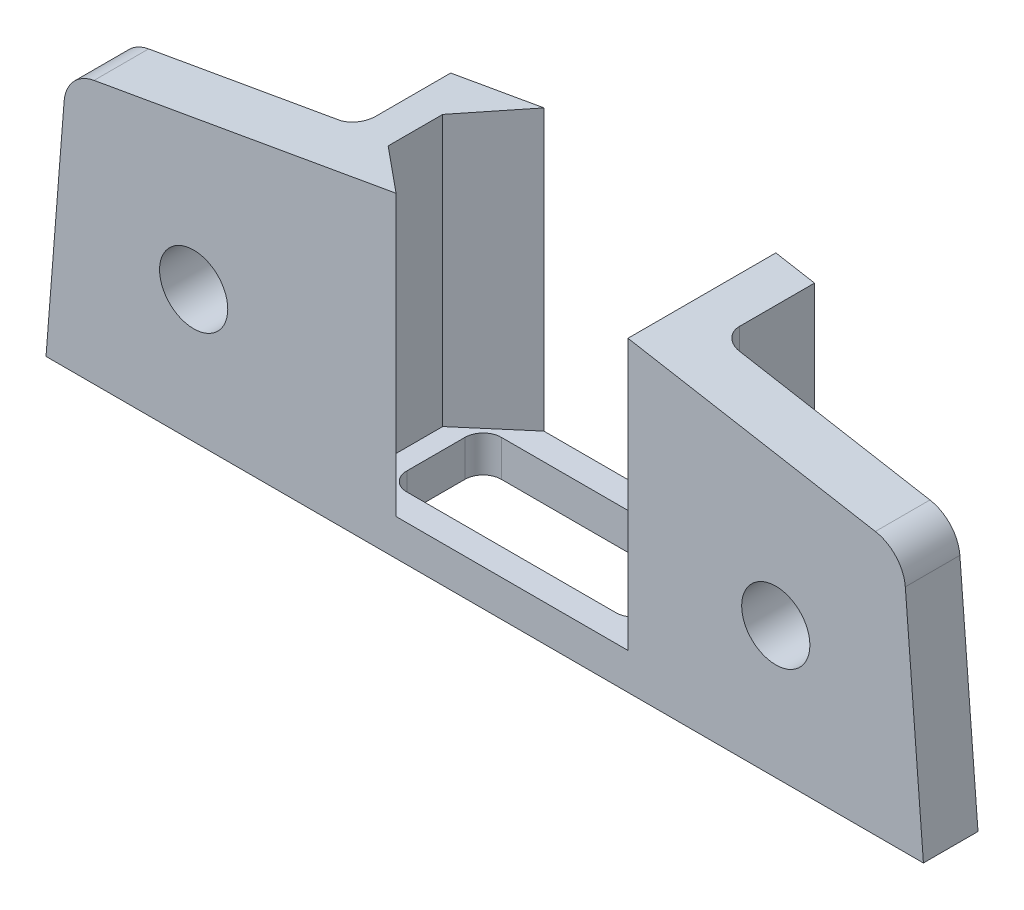
ISO-10303-21;
HEADER;
FILE_DESCRIPTION(('STEP AP214'),'2;1');
FILE_NAME('part.step','',(''),(''),'','','');
FILE_SCHEMA(('AUTOMOTIVE_DESIGN { 1 0 10303 214 1 1 1 1 }'));
ENDSEC;
DATA;
#1=APPLICATION_CONTEXT('core data for automotive mechanical design processes');
#2=APPLICATION_PROTOCOL_DEFINITION('international standard','automotive_design',2000,#1);
#3=PRODUCT_CONTEXT('',#1,'mechanical');
#4=PRODUCT('Part','Part','',(#3));
#5=PRODUCT_RELATED_PRODUCT_CATEGORY('part','',(#4));
#6=PRODUCT_DEFINITION_FORMATION('','',#4);
#7=PRODUCT_DEFINITION_CONTEXT('part definition',#1,'design');
#8=PRODUCT_DEFINITION('design','',#6,#7);
#9=PRODUCT_DEFINITION_SHAPE('','',#8);
#10=(LENGTH_UNIT() NAMED_UNIT(*) SI_UNIT(.MILLI.,.METRE.));
#11=(NAMED_UNIT(*) PLANE_ANGLE_UNIT() SI_UNIT($,.RADIAN.));
#12=(NAMED_UNIT(*) SI_UNIT($,.STERADIAN.) SOLID_ANGLE_UNIT());
#13=UNCERTAINTY_MEASURE_WITH_UNIT(LENGTH_MEASURE(1.E-05),#10,'distance_accuracy_value','');
#14=(GEOMETRIC_REPRESENTATION_CONTEXT(3) GLOBAL_UNCERTAINTY_ASSIGNED_CONTEXT((#13)) GLOBAL_UNIT_ASSIGNED_CONTEXT((#10,
#11,#12)) REPRESENTATION_CONTEXT('',''));
#15=CARTESIAN_POINT('',(0.,0.,0.));
#16=DIRECTION('',(0.,0.,1.));
#17=DIRECTION('',(1.,0.,0.));
#18=AXIS2_PLACEMENT_3D('',#15,#16,#17);
#19=CARTESIAN_POINT('',(21.127664377862,86.2437695070583,0.));
#20=DIRECTION('',(0.,0.,1.));
#21=DIRECTION('',(1.,0.,0.));
#22=AXIS2_PLACEMENT_3D('',#19,#20,#21);
#23=PLANE('',#22);
#24=DIRECTION('',(0.,-1.,0.));
#25=VECTOR('',#24,1.);
#26=CARTESIAN_POINT('',(9.99999999999999,0.,0.));
#27=LINE('',#26,#25);
#28=CARTESIAN_POINT('',(10.,90.2367301929153,0.));
#29=VERTEX_POINT('',#28);
#30=CARTESIAN_POINT('',(10.,73.75,0.));
#31=VERTEX_POINT('',#30);
#32=EDGE_CURVE('E275',#29,#31,#27,.T.);
#33=ORIENTED_EDGE('',*,*,#32,.T.);
#34=DIRECTION('',(1.,0.,0.));
#35=VECTOR('',#34,1.);
#36=CARTESIAN_POINT('',(24.4569685951198,73.75,0.));
#37=LINE('',#36,#35);
#38=CARTESIAN_POINT('',(-9.99999999999997,73.75,0.));
#39=VERTEX_POINT('',#38);
#40=EDGE_CURVE('E302',#39,#31,#37,.T.);
#41=ORIENTED_EDGE('',*,*,#40,.F.);
#42=DIRECTION('',(0.,-1.,0.));
#43=VECTOR('',#42,1.);
#44=CARTESIAN_POINT('',(-9.99999999999993,0.,0.));
#45=LINE('',#44,#43);
#46=CARTESIAN_POINT('',(-10.,90.2367301929153,0.));
#47=VERTEX_POINT('',#46);
#48=EDGE_CURVE('E290',#47,#39,#45,.T.);
#49=ORIENTED_EDGE('',*,*,#48,.F.);
#50=DIRECTION('',(-0.984807753012207,-0.173648177666933,0.));
#51=VECTOR('',#50,1.);
#52=CARTESIAN_POINT('',(0.,92.,0.));
#53=LINE('',#52,#51);
#54=CARTESIAN_POINT('',(-4.875,91.1404059690462,0.));
#55=VERTEX_POINT('',#54);
#56=EDGE_CURVE('E207',#55,#47,#53,.T.);
#57=ORIENTED_EDGE('',*,*,#56,.F.);
#58=DIRECTION('',(0.,1.,0.));
#59=VECTOR('',#58,1.);
#60=CARTESIAN_POINT('',(-4.875,75.75,0.));
#61=LINE('',#60,#59);
#62=CARTESIAN_POINT('',(-4.875,75.75,0.));
#63=VERTEX_POINT('',#62);
#64=EDGE_CURVE('E244',#63,#55,#61,.T.);
#65=ORIENTED_EDGE('',*,*,#64,.F.);
#66=DIRECTION('',(1.,0.,0.));
#67=VECTOR('',#66,1.);
#68=CARTESIAN_POINT('',(0.,75.75,0.));
#69=LINE('',#68,#67);
#70=CARTESIAN_POINT('',(7.875,75.75,0.));
#71=VERTEX_POINT('',#70);
#72=EDGE_CURVE('E251',#63,#71,#69,.T.);
#73=ORIENTED_EDGE('',*,*,#72,.T.);
#74=DIRECTION('',(0.,1.,0.));
#75=VECTOR('',#74,1.);
#76=CARTESIAN_POINT('',(7.875,75.75,0.));
#77=LINE('',#76,#75);
#78=CARTESIAN_POINT('',(7.875,90.6114250269208,0.));
#79=VERTEX_POINT('',#78);
#80=EDGE_CURVE('E241',#71,#79,#77,.T.);
#81=ORIENTED_EDGE('',*,*,#80,.T.);
#82=DIRECTION('',(-0.984807753012208,0.173648177666933,0.));
#83=VECTOR('',#82,1.);
#84=CARTESIAN_POINT('',(21.4749607331959,88.2133850130827,0.));
#85=LINE('',#84,#83);
#86=EDGE_CURVE('E211',#29,#79,#85,.T.);
#87=ORIENTED_EDGE('',*,*,#86,.F.);
#88=EDGE_LOOP('',(#33,#41,#49,#57,#65,#73,#81,#87));
#89=FACE_BOUND('',#88,.T.);
#90=ADVANCED_FACE('F35',(#89),#23,.F.);
#91=CARTESIAN_POINT('',(21.4749607331959,88.2133850130827,8.13));
#92=DIRECTION('',(-0.173648177666933,-0.984807753012208,0.));
#93=DIRECTION('',(0.984807753012208,-0.173648177666933,0.));
#94=AXIS2_PLACEMENT_3D('',#91,#92,#93);
#95=PLANE('',#94);
#96=DIRECTION('',(0.984807753012208,-0.173648177666933,0.));
#97=VECTOR('',#96,1.);
#98=CARTESIAN_POINT('',(15.732926592981,89.2258605561517,5.13));
#99=LINE('',#98,#97);
#100=CARTESIAN_POINT('',(11.,90.0604032122069,5.13));
#101=VERTEX_POINT('',#100);
#102=CARTESIAN_POINT('',(21.4749607331959,88.2133850130827,5.13));
#103=VERTEX_POINT('',#102);
#104=EDGE_CURVE('E284',#101,#103,#99,.T.);
#105=ORIENTED_EDGE('',*,*,#104,.F.);
#106=CARTESIAN_POINT('',(11.,90.0604032122069,4.13));
#107=DIRECTION('',(-0.173648177666933,-0.984807753012208,0.));
#108=DIRECTION('',(0.984807753012208,-0.173648177666933,0.));
#109=AXIS2_PLACEMENT_3D('',#106,#107,#108);
#110=ELLIPSE('',#109,1.01542661188575,1.);
#111=CARTESIAN_POINT('',(10.,90.2367301929153,4.13));
#112=VERTEX_POINT('',#111);
#113=EDGE_CURVE('E144',#101,#112,#110,.T.);
#114=ORIENTED_EDGE('',*,*,#113,.T.);
#115=DIRECTION('',(0.,0.,-1.));
#116=VECTOR('',#115,1.);
#117=CARTESIAN_POINT('',(10.,90.2367301929153,33.4646267322729));
#118=LINE('',#117,#116);
#119=EDGE_CURVE('E272',#112,#29,#118,.T.);
#120=ORIENTED_EDGE('',*,*,#119,.T.);
#121=ORIENTED_EDGE('',*,*,#86,.T.);
#122=DIRECTION('',(0.,0.,-1.));
#123=VECTOR('',#122,1.);
#124=CARTESIAN_POINT('',(7.875,90.6114250269208,8.13));
#125=LINE('',#124,#123);
#126=CARTESIAN_POINT('',(7.875,90.6114250269208,8.13));
#127=VERTEX_POINT('',#126);
#128=EDGE_CURVE('E182',#127,#79,#125,.T.);
#129=ORIENTED_EDGE('',*,*,#128,.F.);
#130=DIRECTION('',(-0.984807753012208,0.173648177666933,0.));
#131=VECTOR('',#130,1.);
#132=CARTESIAN_POINT('',(21.4749607331959,88.2133850130827,8.13));
#133=LINE('',#132,#131);
#134=CARTESIAN_POINT('',(21.4749607331959,88.2133850130827,8.13));
#135=VERTEX_POINT('',#134);
#136=EDGE_CURVE('E223',#135,#127,#133,.T.);
#137=ORIENTED_EDGE('',*,*,#136,.F.);
#138=DIRECTION('',(0.,0.,-1.));
#139=VECTOR('',#138,1.);
#140=CARTESIAN_POINT('',(21.4749607331959,88.2133850130827,8.13));
#141=LINE('',#140,#139);
#142=EDGE_CURVE('E197',#135,#103,#141,.T.);
#143=ORIENTED_EDGE('',*,*,#142,.T.);
#144=EDGE_LOOP('',(#105,#114,#120,#121,#129,#137,#143));
#145=FACE_BOUND('',#144,.T.);
#146=ADVANCED_FACE('F370',(#145),#95,.F.);
#147=CARTESIAN_POINT('',(0.,75.75,0.));
#148=DIRECTION('',(0.,1.,0.));
#149=DIRECTION('',(0.,0.,1.));
#150=AXIS2_PLACEMENT_3D('',#147,#148,#149);
#151=PLANE('',#150);
#152=DIRECTION('',(0.760060792093325,0.,0.649851977239792));
#153=VECTOR('',#152,1.);
#154=CARTESIAN_POINT('',(-6.0743760921997,75.75,7.10453344116925));
#155=LINE('',#154,#153);
#156=CARTESIAN_POINT('',(-7.875,75.75,5.565));
#157=VERTEX_POINT('',#156);
#158=CARTESIAN_POINT('',(-4.875,75.75,8.13));
#159=VERTEX_POINT('',#158);
#160=EDGE_CURVE('E260',#157,#159,#155,.T.);
#161=ORIENTED_EDGE('',*,*,#160,.T.);
#162=DIRECTION('',(1.,0.,0.));
#163=VECTOR('',#162,1.);
#164=CARTESIAN_POINT('',(0.,75.75,8.13));
#165=LINE('',#164,#163);
#166=CARTESIAN_POINT('',(7.875,75.75,8.13));
#167=VERTEX_POINT('',#166);
#168=EDGE_CURVE('E257',#159,#167,#165,.T.);
#169=ORIENTED_EDGE('',*,*,#168,.T.);
#170=DIRECTION('',(0.,0.,1.));
#171=VECTOR('',#170,1.);
#172=CARTESIAN_POINT('',(7.875,75.75,0.));
#173=LINE('',#172,#171);
#174=EDGE_CURVE('E254',#71,#167,#173,.T.);
#175=ORIENTED_EDGE('',*,*,#174,.F.);
#176=ORIENTED_EDGE('',*,*,#72,.F.);
#177=DIRECTION('',(0.760060792093325,0.,-0.649851977239792));
#178=VECTOR('',#177,1.);
#179=CARTESIAN_POINT('',(-2.05874951257203,75.75,-2.40789416675091));
#180=LINE('',#179,#178);
#181=CARTESIAN_POINT('',(-7.875,75.75,2.565));
#182=VERTEX_POINT('',#181);
#183=EDGE_CURVE('E235',#182,#63,#180,.T.);
#184=ORIENTED_EDGE('',*,*,#183,.F.);
#185=DIRECTION('',(0.,0.,1.));
#186=VECTOR('',#185,1.);
#187=CARTESIAN_POINT('',(-7.875,75.75,0.));
#188=LINE('',#187,#186);
#189=EDGE_CURVE('E263',#182,#157,#188,.T.);
#190=ORIENTED_EDGE('',*,*,#189,.T.);
#191=EDGE_LOOP('',(#161,#169,#175,#176,#184,#190));
#192=FACE_BOUND('',#191,.T.);
#193=DIRECTION('',(0.,0.,1.));
#194=VECTOR('',#193,1.);
#195=CARTESIAN_POINT('',(-6.75,75.75,0.));
#196=LINE('',#195,#194);
#197=CARTESIAN_POINT('',(-6.75,75.75,2.465));
#198=VERTEX_POINT('',#197);
#199=CARTESIAN_POINT('',(-6.75,75.75,5.665));
#200=VERTEX_POINT('',#199);
#201=EDGE_CURVE('E179',#198,#200,#196,.T.);
#202=ORIENTED_EDGE('',*,*,#201,.F.);
#203=CARTESIAN_POINT('',(-5.75,75.75,2.465));
#204=DIRECTION('',(0.,1.,0.));
#205=DIRECTION('',(0.,0.,1.));
#206=AXIS2_PLACEMENT_3D('',#203,#204,#205);
#207=CIRCLE('',#206,1.);
#208=CARTESIAN_POINT('',(-5.75,75.75,1.465));
#209=VERTEX_POINT('',#208);
#210=EDGE_CURVE('E65',#198,#209,#207,.F.);
#211=ORIENTED_EDGE('',*,*,#210,.T.);
#212=DIRECTION('',(-1.,0.,0.));
#213=VECTOR('',#212,1.);
#214=CARTESIAN_POINT('',(-6.75,75.75,1.465));
#215=LINE('',#214,#213);
#216=CARTESIAN_POINT('',(5.75,75.75,1.465));
#217=VERTEX_POINT('',#216);
#218=EDGE_CURVE('E266',#217,#209,#215,.T.);
#219=ORIENTED_EDGE('',*,*,#218,.F.);
#220=CARTESIAN_POINT('',(5.75,75.75,2.465));
#221=DIRECTION('',(0.,1.,0.));
#222=DIRECTION('',(0.,0.,1.));
#223=AXIS2_PLACEMENT_3D('',#220,#221,#222);
#224=CIRCLE('',#223,1.);
#225=CARTESIAN_POINT('',(6.75,75.75,2.465));
#226=VERTEX_POINT('',#225);
#227=EDGE_CURVE('E139',#217,#226,#224,.F.);
#228=ORIENTED_EDGE('',*,*,#227,.T.);
#229=DIRECTION('',(0.,0.,-1.));
#230=VECTOR('',#229,1.);
#231=CARTESIAN_POINT('',(6.75,75.75,1.465));
#232=LINE('',#231,#230);
#233=CARTESIAN_POINT('',(6.75,75.75,5.665));
#234=VERTEX_POINT('',#233);
#235=EDGE_CURVE('E269',#234,#226,#232,.T.);
#236=ORIENTED_EDGE('',*,*,#235,.F.);
#237=CARTESIAN_POINT('',(5.75,75.75,5.665));
#238=DIRECTION('',(0.,1.,0.));
#239=DIRECTION('',(0.,0.,1.));
#240=AXIS2_PLACEMENT_3D('',#237,#238,#239);
#241=CIRCLE('',#240,1.);
#242=CARTESIAN_POINT('',(5.75,75.75,6.665));
#243=VERTEX_POINT('',#242);
#244=EDGE_CURVE('E51',#234,#243,#241,.F.);
#245=ORIENTED_EDGE('',*,*,#244,.T.);
#246=DIRECTION('',(1.,0.,0.));
#247=VECTOR('',#246,1.);
#248=CARTESIAN_POINT('',(0.,75.75,6.665));
#249=LINE('',#248,#247);
#250=CARTESIAN_POINT('',(-5.75,75.75,6.665));
#251=VERTEX_POINT('',#250);
#252=EDGE_CURVE('E117',#251,#243,#249,.T.);
#253=ORIENTED_EDGE('',*,*,#252,.F.);
#254=CARTESIAN_POINT('',(-5.75,75.75,5.665));
#255=DIRECTION('',(0.,1.,0.));
#256=DIRECTION('',(0.,0.,1.));
#257=AXIS2_PLACEMENT_3D('',#254,#255,#256);
#258=CIRCLE('',#257,1.);
#259=EDGE_CURVE('E44',#251,#200,#258,.F.);
#260=ORIENTED_EDGE('',*,*,#259,.T.);
#261=EDGE_LOOP('',(#202,#211,#219,#228,#236,#245,#253,#260));
#262=FACE_BOUND('',#261,.T.);
#263=ADVANCED_FACE('F495',(#192,#262),#151,.T.);
#264=CARTESIAN_POINT('',(21.127664377862,86.2437695070583,8.13));
#265=DIRECTION('',(0.,0.,1.));
#266=DIRECTION('',(1.,0.,0.));
#267=AXIS2_PLACEMENT_3D('',#264,#265,#266);
#268=PLANE('',#267);
#269=CARTESIAN_POINT('',(16.,81.,8.13));
#270=DIRECTION('',(0.,0.,1.));
#271=DIRECTION('',(1.,0.,0.));
#272=AXIS2_PLACEMENT_3D('',#269,#270,#271);
#273=CIRCLE('',#272,1.875);
#274=CARTESIAN_POINT('',(17.875,81.,8.13));
#275=VERTEX_POINT('',#274);
#276=EDGE_CURVE('E338',#275,#275,#273,.F.);
#277=ORIENTED_EDGE('',*,*,#276,.T.);
#278=EDGE_LOOP('',(#277));
#279=FACE_BOUND('',#278,.T.);
#280=CARTESIAN_POINT('',(-16.,81.,8.13));
#281=DIRECTION('',(0.,0.,1.));
#282=DIRECTION('',(1.,0.,0.));
#283=AXIS2_PLACEMENT_3D('',#280,#281,#282);
#284=CIRCLE('',#283,1.875);
#285=CARTESIAN_POINT('',(-14.125,81.,8.13));
#286=VERTEX_POINT('',#285);
#287=EDGE_CURVE('E332',#286,#286,#284,.F.);
#288=ORIENTED_EDGE('',*,*,#287,.T.);
#289=EDGE_LOOP('',(#288));
#290=FACE_BOUND('',#289,.T.);
#291=DIRECTION('',(1.,0.,0.));
#292=VECTOR('',#291,1.);
#293=CARTESIAN_POINT('',(24.4569685951198,73.75,8.13));
#294=LINE('',#293,#292);
#295=CARTESIAN_POINT('',(-24.1171297597066,73.75,8.13));
#296=VERTEX_POINT('',#295);
#297=CARTESIAN_POINT('',(24.1171297597066,73.75,8.13));
#298=VERTEX_POINT('',#297);
#299=EDGE_CURVE('E305',#296,#298,#294,.T.);
#300=ORIENTED_EDGE('',*,*,#299,.T.);
#301=DIRECTION('',(-0.0784590957278463,0.996917333733128,0.));
#302=VECTOR('',#301,1.);
#303=CARTESIAN_POINT('',(24.4569685951198,69.4319381799363,8.13));
#304=LINE('',#303,#302);
#305=CARTESIAN_POINT('',(23.1214990453283,86.4006876985139,8.13));
#306=VERTEX_POINT('',#305);
#307=EDGE_CURVE('E210',#298,#306,#304,.T.);
#308=ORIENTED_EDGE('',*,*,#307,.T.);
#309=CARTESIAN_POINT('',(21.127664377862,86.2437695070583,8.13));
#310=DIRECTION('',(0.,0.,1.));
#311=DIRECTION('',(1.,0.,0.));
#312=AXIS2_PLACEMENT_3D('',#309,#310,#311);
#313=CIRCLE('',#312,1.99999999999999);
#314=EDGE_CURVE('E226',#306,#135,#313,.T.);
#315=ORIENTED_EDGE('',*,*,#314,.T.);
#316=ORIENTED_EDGE('',*,*,#136,.T.);
#317=DIRECTION('',(0.,1.,0.));
#318=VECTOR('',#317,1.);
#319=CARTESIAN_POINT('',(7.875,75.75,8.13));
#320=LINE('',#319,#318);
#321=EDGE_CURVE('E238',#167,#127,#320,.T.);
#322=ORIENTED_EDGE('',*,*,#321,.F.);
#323=ORIENTED_EDGE('',*,*,#168,.F.);
#324=DIRECTION('',(0.,1.,0.));
#325=VECTOR('',#324,1.);
#326=CARTESIAN_POINT('',(-4.875,75.75,8.13));
#327=LINE('',#326,#325);
#328=CARTESIAN_POINT('',(-4.875,91.1404059690462,8.13));
#329=VERTEX_POINT('',#328);
#330=EDGE_CURVE('E234',#159,#329,#327,.T.);
#331=ORIENTED_EDGE('',*,*,#330,.T.);
#332=DIRECTION('',(-0.984807753012207,-0.173648177666933,0.));
#333=VECTOR('',#332,1.);
#334=CARTESIAN_POINT('',(0.,92.,8.13));
#335=LINE('',#334,#333);
#336=CARTESIAN_POINT('',(-21.4749607331959,88.2133850130827,8.13));
#337=VERTEX_POINT('',#336);
#338=EDGE_CURVE('E220',#329,#337,#335,.T.);
#339=ORIENTED_EDGE('',*,*,#338,.T.);
#340=CARTESIAN_POINT('',(-21.127664377862,86.2437695070583,8.13));
#341=DIRECTION('',(0.,0.,1.));
#342=DIRECTION('',(1.,0.,0.));
#343=AXIS2_PLACEMENT_3D('',#340,#341,#342);
#344=CIRCLE('',#343,1.99999999999997);
#345=CARTESIAN_POINT('',(-23.1214990453283,86.4006876985139,8.13));
#346=VERTEX_POINT('',#345);
#347=EDGE_CURVE('E217',#337,#346,#344,.T.);
#348=ORIENTED_EDGE('',*,*,#347,.T.);
#349=DIRECTION('',(-0.0784590957278469,-0.996917333733128,0.));
#350=VECTOR('',#349,1.);
#351=CARTESIAN_POINT('',(-23.1214990453283,86.4006876985139,8.13));
#352=LINE('',#351,#350);
#353=EDGE_CURVE('E206',#346,#296,#352,.T.);
#354=ORIENTED_EDGE('',*,*,#353,.T.);
#355=EDGE_LOOP('',(#300,#308,#315,#316,#322,#323,#331,#339,#348,#354));
#356=FACE_BOUND('',#355,.T.);
#357=ADVANCED_FACE('F400',(#279,#290,#356),#268,.T.);
#358=CARTESIAN_POINT('',(0.,92.,8.13));
#359=DIRECTION('',(0.173648177666934,-0.984807753012208,0.));
#360=DIRECTION('',(0.984807753012207,0.173648177666933,0.));
#361=AXIS2_PLACEMENT_3D('',#358,#359,#360);
#362=PLANE('',#361);
#363=ORIENTED_EDGE('',*,*,#56,.T.);
#364=DIRECTION('',(0.,0.,-1.));
#365=VECTOR('',#364,1.);
#366=CARTESIAN_POINT('',(-10.,90.2367301929153,33.4646267322729));
#367=LINE('',#366,#365);
#368=CARTESIAN_POINT('',(-10.,90.2367301929153,4.13));
#369=VERTEX_POINT('',#368);
#370=EDGE_CURVE('E287',#369,#47,#367,.T.);
#371=ORIENTED_EDGE('',*,*,#370,.F.);
#372=CARTESIAN_POINT('',(-11.,90.0604032122069,4.13));
#373=DIRECTION('',(0.173648177666934,-0.984807753012208,0.));
#374=DIRECTION('',(0.984807753012207,0.173648177666933,0.));
#375=AXIS2_PLACEMENT_3D('',#372,#373,#374);
#376=ELLIPSE('',#375,1.01542661188575,1.);
#377=CARTESIAN_POINT('',(-11.,90.0604032122069,5.13));
#378=VERTEX_POINT('',#377);
#379=EDGE_CURVE('E150',#369,#378,#376,.T.);
#380=ORIENTED_EDGE('',*,*,#379,.T.);
#381=DIRECTION('',(0.984807753012208,0.173648177666933,0.));
#382=VECTOR('',#381,1.);
#383=CARTESIAN_POINT('',(-15.732926592981,89.2258605561517,5.13));
#384=LINE('',#383,#382);
#385=CARTESIAN_POINT('',(-21.4749607331959,88.2133850130827,5.13));
#386=VERTEX_POINT('',#385);
#387=EDGE_CURVE('E293',#386,#378,#384,.T.);
#388=ORIENTED_EDGE('',*,*,#387,.F.);
#389=DIRECTION('',(0.,0.,-1.));
#390=VECTOR('',#389,1.);
#391=CARTESIAN_POINT('',(-21.4749607331959,88.2133850130827,8.13));
#392=LINE('',#391,#390);
#393=EDGE_CURVE('E200',#337,#386,#392,.T.);
#394=ORIENTED_EDGE('',*,*,#393,.F.);
#395=ORIENTED_EDGE('',*,*,#338,.F.);
#396=DIRECTION('',(-0.753325602402793,-0.132831628962072,-0.644093390054387));
#397=VECTOR('',#396,1.);
#398=CARTESIAN_POINT('',(-2.02242443866979,91.6433920050183,10.5689521049373));
#399=LINE('',#398,#397);
#400=CARTESIAN_POINT('',(-7.875,90.6114250269208,5.565));
#401=VERTEX_POINT('',#400);
#402=EDGE_CURVE('E191',#329,#401,#399,.T.);
#403=ORIENTED_EDGE('',*,*,#402,.T.);
#404=DIRECTION('',(0.,0.,-1.));
#405=VECTOR('',#404,1.);
#406=CARTESIAN_POINT('',(-7.875,90.6114250269208,8.13));
#407=LINE('',#406,#405);
#408=CARTESIAN_POINT('',(-7.875,90.6114250269208,2.565));
#409=VERTEX_POINT('',#408);
#410=EDGE_CURVE('E188',#401,#409,#407,.T.);
#411=ORIENTED_EDGE('',*,*,#410,.T.);
#412=DIRECTION('',(-0.753325602402792,-0.132831628962072,0.644093390054387));
#413=VECTOR('',#412,1.);
#414=CARTESIAN_POINT('',(-5.96719833253944,90.9478219347347,0.933829574321227));
#415=LINE('',#414,#413);
#416=EDGE_CURVE('E185',#55,#409,#415,.T.);
#417=ORIENTED_EDGE('',*,*,#416,.F.);
#418=EDGE_LOOP('',(#363,#371,#380,#388,#394,#395,#403,#411,#417));
#419=FACE_BOUND('',#418,.T.);
#420=ADVANCED_FACE('F448',(#419),#362,.F.);
#421=CARTESIAN_POINT('',(24.4569685951198,69.4319381799363,8.13));
#422=DIRECTION('',(-0.996917333733128,-0.0784590957278463,0.));
#423=DIRECTION('',(0.0784590957278463,-0.996917333733128,0.));
#424=AXIS2_PLACEMENT_3D('',#421,#422,#423);
#425=PLANE('',#424);
#426=ORIENTED_EDGE('',*,*,#307,.F.);
#427=DIRECTION('',(0.,0.,1.));
#428=VECTOR('',#427,1.);
#429=CARTESIAN_POINT('',(24.1171297597066,73.75,8.131));
#430=LINE('',#429,#428);
#431=CARTESIAN_POINT('',(24.1171297597066,73.75,5.13));
#432=VERTEX_POINT('',#431);
#433=EDGE_CURVE('E308',#432,#298,#430,.T.);
#434=ORIENTED_EDGE('',*,*,#433,.F.);
#435=DIRECTION('',(0.0784590957278463,-0.996917333733128,0.));
#436=VECTOR('',#435,1.);
#437=CARTESIAN_POINT('',(29.737189714353,2.34036758668711,5.13));
#438=LINE('',#437,#436);
#439=CARTESIAN_POINT('',(23.1214990453283,86.4006876985139,5.13));
#440=VERTEX_POINT('',#439);
#441=EDGE_CURVE('E278',#440,#432,#438,.T.);
#442=ORIENTED_EDGE('',*,*,#441,.F.);
#443=DIRECTION('',(0.,0.,-1.));
#444=VECTOR('',#443,1.);
#445=CARTESIAN_POINT('',(23.1214990453283,86.4006876985139,8.13));
#446=LINE('',#445,#444);
#447=EDGE_CURVE('E194',#306,#440,#446,.T.);
#448=ORIENTED_EDGE('',*,*,#447,.F.);
#449=EDGE_LOOP('',(#426,#434,#442,#448));
#450=FACE_BOUND('',#449,.T.);
#451=ADVANCED_FACE('F503',(#450),#425,.F.);
#452=CARTESIAN_POINT('',(21.127664377862,86.2437695070583,8.13));
#453=DIRECTION('',(0.,0.,-1.));
#454=DIRECTION('',(-1.,0.,0.));
#455=AXIS2_PLACEMENT_3D('',#452,#453,#454);
#456=CYLINDRICAL_SURFACE('',#455,1.99999999999999);
#457=ORIENTED_EDGE('',*,*,#447,.T.);
#458=CARTESIAN_POINT('',(21.127664377862,86.2437695070583,5.13));
#459=DIRECTION('',(0.,0.,1.));
#460=DIRECTION('',(1.,0.,0.));
#461=AXIS2_PLACEMENT_3D('',#458,#459,#460);
#462=CIRCLE('',#461,1.99999999999999);
#463=EDGE_CURVE('E281',#103,#440,#462,.F.);
#464=ORIENTED_EDGE('',*,*,#463,.F.);
#465=ORIENTED_EDGE('',*,*,#142,.F.);
#466=ORIENTED_EDGE('',*,*,#314,.F.);
#467=EDGE_LOOP('',(#457,#464,#465,#466));
#468=FACE_BOUND('',#467,.T.);
#469=ADVANCED_FACE('F508',(#468),#456,.T.);
#470=CARTESIAN_POINT('',(-21.127664377862,86.2437695070583,8.13));
#471=DIRECTION('',(0.,0.,-1.));
#472=DIRECTION('',(-1.,0.,0.));
#473=AXIS2_PLACEMENT_3D('',#470,#471,#472);
#474=CYLINDRICAL_SURFACE('',#473,1.99999999999997);
#475=ORIENTED_EDGE('',*,*,#393,.T.);
#476=CARTESIAN_POINT('',(-21.127664377862,86.2437695070583,5.13));
#477=DIRECTION('',(0.,0.,1.));
#478=DIRECTION('',(1.,0.,0.));
#479=AXIS2_PLACEMENT_3D('',#476,#477,#478);
#480=CIRCLE('',#479,1.99999999999997);
#481=CARTESIAN_POINT('',(-23.1214990453283,86.4006876985139,5.13));
#482=VERTEX_POINT('',#481);
#483=EDGE_CURVE('E296',#482,#386,#480,.F.);
#484=ORIENTED_EDGE('',*,*,#483,.F.);
#485=DIRECTION('',(0.,0.,-1.));
#486=VECTOR('',#485,1.);
#487=CARTESIAN_POINT('',(-23.1214990453283,86.4006876985139,8.13));
#488=LINE('',#487,#486);
#489=EDGE_CURVE('E203',#346,#482,#488,.T.);
#490=ORIENTED_EDGE('',*,*,#489,.F.);
#491=ORIENTED_EDGE('',*,*,#347,.F.);
#492=EDGE_LOOP('',(#475,#484,#490,#491));
#493=FACE_BOUND('',#492,.T.);
#494=ADVANCED_FACE('F473',(#493),#474,.T.);
#495=CARTESIAN_POINT('',(-23.1214990453283,86.4006876985139,8.13));
#496=DIRECTION('',(0.996917333733128,-0.0784590957278469,0.));
#497=DIRECTION('',(0.0784590957278469,0.996917333733128,0.));
#498=AXIS2_PLACEMENT_3D('',#495,#496,#497);
#499=PLANE('',#498);
#500=DIRECTION('',(0.0784590957278469,0.996917333733128,0.));
#501=VECTOR('',#500,1.);
#502=CARTESIAN_POINT('',(-29.737189714353,2.34036758668713,5.13));
#503=LINE('',#502,#501);
#504=CARTESIAN_POINT('',(-24.1171297597066,73.75,5.13));
#505=VERTEX_POINT('',#504);
#506=EDGE_CURVE('E299',#505,#482,#503,.T.);
#507=ORIENTED_EDGE('',*,*,#506,.F.);
#508=DIRECTION('',(0.,0.,-1.));
#509=VECTOR('',#508,1.);
#510=CARTESIAN_POINT('',(-24.1171297597066,73.75,8.131));
#511=LINE('',#510,#509);
#512=EDGE_CURVE('E311',#296,#505,#511,.T.);
#513=ORIENTED_EDGE('',*,*,#512,.F.);
#514=ORIENTED_EDGE('',*,*,#353,.F.);
#515=ORIENTED_EDGE('',*,*,#489,.T.);
#516=EDGE_LOOP('',(#507,#513,#514,#515));
#517=FACE_BOUND('',#516,.T.);
#518=ADVANCED_FACE('F463',(#517),#499,.F.);
#519=CARTESIAN_POINT('',(7.875,75.75,0.));
#520=DIRECTION('',(-1.,0.,0.));
#521=DIRECTION('',(0.,0.,1.));
#522=AXIS2_PLACEMENT_3D('',#519,#520,#521);
#523=PLANE('',#522);
#524=ORIENTED_EDGE('',*,*,#128,.T.);
#525=ORIENTED_EDGE('',*,*,#80,.F.);
#526=ORIENTED_EDGE('',*,*,#174,.T.);
#527=ORIENTED_EDGE('',*,*,#321,.T.);
#528=EDGE_LOOP('',(#524,#525,#526,#527));
#529=FACE_BOUND('',#528,.T.);
#530=ADVANCED_FACE('F391',(#529),#523,.T.);
#531=CARTESIAN_POINT('',(-7.875,75.75,0.));
#532=DIRECTION('',(-1.,0.,0.));
#533=DIRECTION('',(0.,0.,1.));
#534=AXIS2_PLACEMENT_3D('',#531,#532,#533);
#535=PLANE('',#534);
#536=DIRECTION('',(0.,1.,0.));
#537=VECTOR('',#536,1.);
#538=CARTESIAN_POINT('',(-7.875,75.75,5.565));
#539=LINE('',#538,#537);
#540=EDGE_CURVE('E231',#157,#401,#539,.T.);
#541=ORIENTED_EDGE('',*,*,#540,.F.);
#542=ORIENTED_EDGE('',*,*,#189,.F.);
#543=DIRECTION('',(0.,1.,0.));
#544=VECTOR('',#543,1.);
#545=CARTESIAN_POINT('',(-7.875,75.75,2.565));
#546=LINE('',#545,#544);
#547=EDGE_CURVE('E214',#182,#409,#546,.T.);
#548=ORIENTED_EDGE('',*,*,#547,.T.);
#549=ORIENTED_EDGE('',*,*,#410,.F.);
#550=EDGE_LOOP('',(#541,#542,#548,#549));
#551=FACE_BOUND('',#550,.T.);
#552=ADVANCED_FACE('F489',(#551),#535,.F.);
#553=CARTESIAN_POINT('',(-2.05874951257203,75.75,-2.40789416675091));
#554=DIRECTION('',(0.649851977239792,0.,0.760060792093325));
#555=DIRECTION('',(0.760060792093325,0.,-0.649851977239792));
#556=AXIS2_PLACEMENT_3D('',#553,#554,#555);
#557=PLANE('',#556);
#558=ORIENTED_EDGE('',*,*,#416,.T.);
#559=ORIENTED_EDGE('',*,*,#547,.F.);
#560=ORIENTED_EDGE('',*,*,#183,.T.);
#561=ORIENTED_EDGE('',*,*,#64,.T.);
#562=EDGE_LOOP('',(#558,#559,#560,#561));
#563=FACE_BOUND('',#562,.T.);
#564=ADVANCED_FACE('F499',(#563),#557,.T.);
#565=CARTESIAN_POINT('',(-6.0743760921997,75.75,7.10453344116925));
#566=DIRECTION('',(-0.649851977239792,0.,0.760060792093325));
#567=DIRECTION('',(0.760060792093325,0.,0.649851977239792));
#568=AXIS2_PLACEMENT_3D('',#565,#566,#567);
#569=PLANE('',#568);
#570=ORIENTED_EDGE('',*,*,#330,.F.);
#571=ORIENTED_EDGE('',*,*,#160,.F.);
#572=ORIENTED_EDGE('',*,*,#540,.T.);
#573=ORIENTED_EDGE('',*,*,#402,.F.);
#574=EDGE_LOOP('',(#570,#571,#572,#573));
#575=FACE_BOUND('',#574,.T.);
#576=ADVANCED_FACE('F492',(#575),#569,.F.);
#577=CARTESIAN_POINT('',(6.75,69.4309381799363,1.465));
#578=DIRECTION('',(1.,0.,0.));
#579=DIRECTION('',(0.,0.,-1.));
#580=AXIS2_PLACEMENT_3D('',#577,#578,#579);
#581=PLANE('',#580);
#582=ORIENTED_EDGE('',*,*,#235,.T.);
#583=DIRECTION('',(0.,1.,0.));
#584=VECTOR('',#583,1.);
#585=CARTESIAN_POINT('',(6.75,73.75,2.465));
#586=LINE('',#585,#584);
#587=CARTESIAN_POINT('',(6.75,73.75,2.465));
#588=VERTEX_POINT('',#587);
#589=EDGE_CURVE('E156',#226,#588,#586,.F.);
#590=ORIENTED_EDGE('',*,*,#589,.T.);
#591=DIRECTION('',(0.,0.,-1.));
#592=VECTOR('',#591,1.);
#593=CARTESIAN_POINT('',(6.75,73.75,8.131));
#594=LINE('',#593,#592);
#595=CARTESIAN_POINT('',(6.75,73.75,5.665));
#596=VERTEX_POINT('',#595);
#597=EDGE_CURVE('E127',#596,#588,#594,.T.);
#598=ORIENTED_EDGE('',*,*,#597,.F.);
#599=DIRECTION('',(0.,1.,0.));
#600=VECTOR('',#599,1.);
#601=CARTESIAN_POINT('',(6.75,75.75,5.665));
#602=LINE('',#601,#600);
#603=EDGE_CURVE('E133',#596,#234,#602,.T.);
#604=ORIENTED_EDGE('',*,*,#603,.T.);
#605=EDGE_LOOP('',(#582,#590,#598,#604));
#606=FACE_BOUND('',#605,.T.);
#607=ADVANCED_FACE('F563',(#606),#581,.F.);
#608=CARTESIAN_POINT('',(-6.75,69.4309381799363,6.665));
#609=DIRECTION('',(0.,0.,1.));
#610=DIRECTION('',(1.,0.,0.));
#611=AXIS2_PLACEMENT_3D('',#608,#609,#610);
#612=PLANE('',#611);
#613=ORIENTED_EDGE('',*,*,#252,.T.);
#614=DIRECTION('',(0.,1.,0.));
#615=VECTOR('',#614,1.);
#616=CARTESIAN_POINT('',(5.75,73.75,6.665));
#617=LINE('',#616,#615);
#618=CARTESIAN_POINT('',(5.75,73.75,6.665));
#619=VERTEX_POINT('',#618);
#620=EDGE_CURVE('E112',#243,#619,#617,.F.);
#621=ORIENTED_EDGE('',*,*,#620,.T.);
#622=DIRECTION('',(1.,0.,0.));
#623=VECTOR('',#622,1.);
#624=CARTESIAN_POINT('',(24.4569685951198,73.75,6.665));
#625=LINE('',#624,#623);
#626=CARTESIAN_POINT('',(-5.75,73.75,6.665));
#627=VERTEX_POINT('',#626);
#628=EDGE_CURVE('E115',#627,#619,#625,.T.);
#629=ORIENTED_EDGE('',*,*,#628,.F.);
#630=DIRECTION('',(0.,1.,0.));
#631=VECTOR('',#630,1.);
#632=CARTESIAN_POINT('',(-5.75,75.75,6.665));
#633=LINE('',#632,#631);
#634=EDGE_CURVE('E121',#627,#251,#633,.T.);
#635=ORIENTED_EDGE('',*,*,#634,.T.);
#636=EDGE_LOOP('',(#613,#621,#629,#635));
#637=FACE_BOUND('',#636,.T.);
#638=ADVANCED_FACE('F113',(#637),#612,.F.);
#639=CARTESIAN_POINT('',(-6.75,69.4309381799363,1.465));
#640=DIRECTION('',(-1.,0.,0.));
#641=DIRECTION('',(0.,0.,1.));
#642=AXIS2_PLACEMENT_3D('',#639,#640,#641);
#643=PLANE('',#642);
#644=DIRECTION('',(0.,0.,1.));
#645=VECTOR('',#644,1.);
#646=CARTESIAN_POINT('',(-6.75,73.75,8.13100000000001));
#647=LINE('',#646,#645);
#648=CARTESIAN_POINT('',(-6.75,73.75,2.465));
#649=VERTEX_POINT('',#648);
#650=CARTESIAN_POINT('',(-6.75,73.75,5.665));
#651=VERTEX_POINT('',#650);
#652=EDGE_CURVE('E128',#649,#651,#647,.T.);
#653=ORIENTED_EDGE('',*,*,#652,.F.);
#654=DIRECTION('',(0.,1.,0.));
#655=VECTOR('',#654,1.);
#656=CARTESIAN_POINT('',(-6.75,75.75,2.465));
#657=LINE('',#656,#655);
#658=EDGE_CURVE('E164',#649,#198,#657,.T.);
#659=ORIENTED_EDGE('',*,*,#658,.T.);
#660=ORIENTED_EDGE('',*,*,#201,.T.);
#661=DIRECTION('',(0.,1.,0.));
#662=VECTOR('',#661,1.);
#663=CARTESIAN_POINT('',(-6.75,73.75,5.665));
#664=LINE('',#663,#662);
#665=EDGE_CURVE('E77',#200,#651,#664,.F.);
#666=ORIENTED_EDGE('',*,*,#665,.T.);
#667=EDGE_LOOP('',(#653,#659,#660,#666));
#668=FACE_BOUND('',#667,.T.);
#669=ADVANCED_FACE('F562',(#668),#643,.F.);
#670=CARTESIAN_POINT('',(-6.75,69.4309381799363,1.465));
#671=DIRECTION('',(0.,0.,-1.));
#672=DIRECTION('',(-1.,0.,0.));
#673=AXIS2_PLACEMENT_3D('',#670,#671,#672);
#674=PLANE('',#673);
#675=ORIENTED_EDGE('',*,*,#218,.T.);
#676=DIRECTION('',(0.,1.,0.));
#677=VECTOR('',#676,1.);
#678=CARTESIAN_POINT('',(-5.75,73.75,1.465));
#679=LINE('',#678,#677);
#680=CARTESIAN_POINT('',(-5.75,73.75,1.465));
#681=VERTEX_POINT('',#680);
#682=EDGE_CURVE('E159',#209,#681,#679,.F.);
#683=ORIENTED_EDGE('',*,*,#682,.T.);
#684=DIRECTION('',(-1.,0.,0.));
#685=VECTOR('',#684,1.);
#686=CARTESIAN_POINT('',(24.4569685951198,73.75,1.465));
#687=LINE('',#686,#685);
#688=CARTESIAN_POINT('',(5.75,73.75,1.465));
#689=VERTEX_POINT('',#688);
#690=EDGE_CURVE('E316',#689,#681,#687,.T.);
#691=ORIENTED_EDGE('',*,*,#690,.F.);
#692=DIRECTION('',(0.,1.,0.));
#693=VECTOR('',#692,1.);
#694=CARTESIAN_POINT('',(5.75,75.75,1.465));
#695=LINE('',#694,#693);
#696=EDGE_CURVE('E161',#689,#217,#695,.T.);
#697=ORIENTED_EDGE('',*,*,#696,.T.);
#698=EDGE_LOOP('',(#675,#683,#691,#697));
#699=FACE_BOUND('',#698,.T.);
#700=ADVANCED_FACE('F559',(#699),#674,.F.);
#701=CARTESIAN_POINT('',(9.99999999999999,0.,33.4646267322729));
#702=DIRECTION('',(1.,0.,0.));
#703=DIRECTION('',(0.,1.,0.));
#704=AXIS2_PLACEMENT_3D('',#701,#702,#703);
#705=PLANE('',#704);
#706=ORIENTED_EDGE('',*,*,#119,.F.);
#707=DIRECTION('',(0.,-1.,0.));
#708=VECTOR('',#707,1.);
#709=CARTESIAN_POINT('',(9.99999999999999,0.,4.13));
#710=LINE('',#709,#708);
#711=CARTESIAN_POINT('',(10.,73.75,4.13));
#712=VERTEX_POINT('',#711);
#713=EDGE_CURVE('E170',#112,#712,#710,.T.);
#714=ORIENTED_EDGE('',*,*,#713,.T.);
#715=DIRECTION('',(0.,0.,-1.));
#716=VECTOR('',#715,1.);
#717=CARTESIAN_POINT('',(10.,73.75,8.131));
#718=LINE('',#717,#716);
#719=EDGE_CURVE('E325',#712,#31,#718,.T.);
#720=ORIENTED_EDGE('',*,*,#719,.T.);
#721=ORIENTED_EDGE('',*,*,#32,.F.);
#722=EDGE_LOOP('',(#706,#714,#720,#721));
#723=FACE_BOUND('',#722,.T.);
#724=ADVANCED_FACE('F350',(#723),#705,.T.);
#725=CARTESIAN_POINT('',(21.127664377862,86.2437695070583,5.13));
#726=DIRECTION('',(0.,0.,1.));
#727=DIRECTION('',(1.,0.,0.));
#728=AXIS2_PLACEMENT_3D('',#725,#726,#727);
#729=PLANE('',#728);
#730=CARTESIAN_POINT('',(16.,81.,5.13));
#731=DIRECTION('',(0.,0.,-1.));
#732=DIRECTION('',(-1.,0.,0.));
#733=AXIS2_PLACEMENT_3D('',#730,#731,#732);
#734=CIRCLE('',#733,1.875);
#735=CARTESIAN_POINT('',(14.125,81.,5.13));
#736=VERTEX_POINT('',#735);
#737=EDGE_CURVE('E335',#736,#736,#734,.T.);
#738=ORIENTED_EDGE('',*,*,#737,.F.);
#739=EDGE_LOOP('',(#738));
#740=FACE_BOUND('',#739,.T.);
#741=DIRECTION('',(1.,0.,0.));
#742=VECTOR('',#741,1.);
#743=CARTESIAN_POINT('',(24.4569685951198,73.75,5.13));
#744=LINE('',#743,#742);
#745=CARTESIAN_POINT('',(11.,73.75,5.13));
#746=VERTEX_POINT('',#745);
#747=EDGE_CURVE('E319',#746,#432,#744,.T.);
#748=ORIENTED_EDGE('',*,*,#747,.F.);
#749=DIRECTION('',(0.,-1.,0.));
#750=VECTOR('',#749,1.);
#751=CARTESIAN_POINT('',(11.,86.2437695070583,5.13));
#752=LINE('',#751,#750);
#753=EDGE_CURVE('E167',#746,#101,#752,.F.);
#754=ORIENTED_EDGE('',*,*,#753,.T.);
#755=ORIENTED_EDGE('',*,*,#104,.T.);
#756=ORIENTED_EDGE('',*,*,#463,.T.);
#757=ORIENTED_EDGE('',*,*,#441,.T.);
#758=EDGE_LOOP('',(#748,#754,#755,#756,#757));
#759=FACE_BOUND('',#758,.T.);
#760=ADVANCED_FACE('F346',(#740,#759),#729,.F.);
#761=CARTESIAN_POINT('',(-9.99999999999993,0.,33.4646267322729));
#762=DIRECTION('',(1.,0.,0.));
#763=DIRECTION('',(0.,1.,0.));
#764=AXIS2_PLACEMENT_3D('',#761,#762,#763);
#765=PLANE('',#764);
#766=DIRECTION('',(0.,0.,-1.));
#767=VECTOR('',#766,1.);
#768=CARTESIAN_POINT('',(-9.99999999999999,73.75,8.131));
#769=LINE('',#768,#767);
#770=CARTESIAN_POINT('',(-9.99999999999999,73.75,4.13));
#771=VERTEX_POINT('',#770);
#772=EDGE_CURVE('E328',#771,#39,#769,.T.);
#773=ORIENTED_EDGE('',*,*,#772,.F.);
#774=DIRECTION('',(0.,-1.,0.));
#775=VECTOR('',#774,1.);
#776=CARTESIAN_POINT('',(-10.,90.2367301929153,4.13));
#777=LINE('',#776,#775);
#778=EDGE_CURVE('E173',#771,#369,#777,.F.);
#779=ORIENTED_EDGE('',*,*,#778,.T.);
#780=ORIENTED_EDGE('',*,*,#370,.T.);
#781=ORIENTED_EDGE('',*,*,#48,.T.);
#782=EDGE_LOOP('',(#773,#779,#780,#781));
#783=FACE_BOUND('',#782,.T.);
#784=ADVANCED_FACE('F349',(#783),#765,.F.);
#785=CARTESIAN_POINT('',(21.127664377862,86.2437695070583,5.13));
#786=DIRECTION('',(0.,0.,1.));
#787=DIRECTION('',(1.,0.,0.));
#788=AXIS2_PLACEMENT_3D('',#785,#786,#787);
#789=PLANE('',#788);
#790=CARTESIAN_POINT('',(-16.,81.,5.13));
#791=DIRECTION('',(0.,0.,-1.));
#792=DIRECTION('',(-1.,0.,0.));
#793=AXIS2_PLACEMENT_3D('',#790,#791,#792);
#794=CIRCLE('',#793,1.875);
#795=CARTESIAN_POINT('',(-17.875,81.,5.13));
#796=VERTEX_POINT('',#795);
#797=EDGE_CURVE('E331',#796,#796,#794,.T.);
#798=ORIENTED_EDGE('',*,*,#797,.F.);
#799=EDGE_LOOP('',(#798));
#800=FACE_BOUND('',#799,.T.);
#801=ORIENTED_EDGE('',*,*,#387,.T.);
#802=DIRECTION('',(0.,-1.,0.));
#803=VECTOR('',#802,1.);
#804=CARTESIAN_POINT('',(-11.,73.75,5.13));
#805=LINE('',#804,#803);
#806=CARTESIAN_POINT('',(-11.,73.75,5.13));
#807=VERTEX_POINT('',#806);
#808=EDGE_CURVE('E176',#378,#807,#805,.T.);
#809=ORIENTED_EDGE('',*,*,#808,.T.);
#810=DIRECTION('',(1.,0.,0.));
#811=VECTOR('',#810,1.);
#812=CARTESIAN_POINT('',(24.4569685951198,73.75,5.13));
#813=LINE('',#812,#811);
#814=EDGE_CURVE('E322',#505,#807,#813,.T.);
#815=ORIENTED_EDGE('',*,*,#814,.F.);
#816=ORIENTED_EDGE('',*,*,#506,.T.);
#817=ORIENTED_EDGE('',*,*,#483,.T.);
#818=EDGE_LOOP('',(#801,#809,#815,#816,#817));
#819=FACE_BOUND('',#818,.T.);
#820=ADVANCED_FACE('F456',(#800,#819),#789,.F.);
#821=CARTESIAN_POINT('',(24.4569685951198,73.75,8.131));
#822=DIRECTION('',(0.,1.,0.));
#823=DIRECTION('',(0.,0.,1.));
#824=AXIS2_PLACEMENT_3D('',#821,#822,#823);
#825=PLANE('',#824);
#826=ORIENTED_EDGE('',*,*,#719,.F.);
#827=CARTESIAN_POINT('',(11.,73.75,4.13));
#828=DIRECTION('',(0.,1.,0.));
#829=DIRECTION('',(0.,0.,1.));
#830=AXIS2_PLACEMENT_3D('',#827,#828,#829);
#831=CIRCLE('',#830,1.);
#832=EDGE_CURVE('E147',#712,#746,#831,.T.);
#833=ORIENTED_EDGE('',*,*,#832,.T.);
#834=ORIENTED_EDGE('',*,*,#747,.T.);
#835=ORIENTED_EDGE('',*,*,#433,.T.);
#836=ORIENTED_EDGE('',*,*,#299,.F.);
#837=ORIENTED_EDGE('',*,*,#512,.T.);
#838=ORIENTED_EDGE('',*,*,#814,.T.);
#839=CARTESIAN_POINT('',(-11.,73.75,4.13));
#840=DIRECTION('',(0.,1.,0.));
#841=DIRECTION('',(0.,0.,1.));
#842=AXIS2_PLACEMENT_3D('',#839,#840,#841);
#843=CIRCLE('',#842,1.);
#844=EDGE_CURVE('E120',#807,#771,#843,.T.);
#845=ORIENTED_EDGE('',*,*,#844,.T.);
#846=ORIENTED_EDGE('',*,*,#772,.T.);
#847=ORIENTED_EDGE('',*,*,#40,.T.);
#848=EDGE_LOOP('',(#826,#833,#834,#835,#836,#837,#838,#845,#846,#847));
#849=FACE_BOUND('',#848,.T.);
#850=ORIENTED_EDGE('',*,*,#628,.T.);
#851=CARTESIAN_POINT('',(5.75,73.75,5.665));
#852=DIRECTION('',(0.,1.,0.));
#853=DIRECTION('',(0.,0.,1.));
#854=AXIS2_PLACEMENT_3D('',#851,#852,#853);
#855=CIRCLE('',#854,1.);
#856=EDGE_CURVE('E125',#619,#596,#855,.T.);
#857=ORIENTED_EDGE('',*,*,#856,.T.);
#858=ORIENTED_EDGE('',*,*,#597,.T.);
#859=CARTESIAN_POINT('',(5.75,73.75,2.465));
#860=DIRECTION('',(0.,1.,0.));
#861=DIRECTION('',(0.,0.,1.));
#862=AXIS2_PLACEMENT_3D('',#859,#860,#861);
#863=CIRCLE('',#862,1.);
#864=EDGE_CURVE('E135',#588,#689,#863,.T.);
#865=ORIENTED_EDGE('',*,*,#864,.T.);
#866=ORIENTED_EDGE('',*,*,#690,.T.);
#867=CARTESIAN_POINT('',(-5.75,73.75,2.465));
#868=DIRECTION('',(0.,1.,0.));
#869=DIRECTION('',(0.,0.,1.));
#870=AXIS2_PLACEMENT_3D('',#867,#868,#869);
#871=CIRCLE('',#870,1.);
#872=EDGE_CURVE('E141',#681,#649,#871,.T.);
#873=ORIENTED_EDGE('',*,*,#872,.T.);
#874=ORIENTED_EDGE('',*,*,#652,.T.);
#875=CARTESIAN_POINT('',(-5.75,73.75,5.665));
#876=DIRECTION('',(0.,1.,0.));
#877=DIRECTION('',(0.,0.,1.));
#878=AXIS2_PLACEMENT_3D('',#875,#876,#877);
#879=CIRCLE('',#878,1.);
#880=EDGE_CURVE('E12',#651,#627,#879,.T.);
#881=ORIENTED_EDGE('',*,*,#880,.T.);
#882=EDGE_LOOP('',(#850,#857,#858,#865,#866,#873,#874,#881));
#883=FACE_BOUND('',#882,.T.);
#884=ADVANCED_FACE('F123',(#849,#883),#825,.F.);
#885=CARTESIAN_POINT('',(-11.,86.2437695070582,4.13));
#886=DIRECTION('',(0.,1.,0.));
#887=DIRECTION('',(-1.,0.,0.));
#888=AXIS2_PLACEMENT_3D('',#885,#886,#887);
#889=CYLINDRICAL_SURFACE('',#888,1.);
#890=ORIENTED_EDGE('',*,*,#379,.F.);
#891=ORIENTED_EDGE('',*,*,#778,.F.);
#892=ORIENTED_EDGE('',*,*,#844,.F.);
#893=ORIENTED_EDGE('',*,*,#808,.F.);
#894=EDGE_LOOP('',(#890,#891,#892,#893));
#895=FACE_BOUND('',#894,.T.);
#896=ADVANCED_FACE('F453',(#895),#889,.F.);
#897=CARTESIAN_POINT('',(11.,0.,4.13));
#898=DIRECTION('',(0.,-1.,0.));
#899=DIRECTION('',(1.,0.,0.));
#900=AXIS2_PLACEMENT_3D('',#897,#898,#899);
#901=CYLINDRICAL_SURFACE('',#900,1.);
#902=ORIENTED_EDGE('',*,*,#113,.F.);
#903=ORIENTED_EDGE('',*,*,#753,.F.);
#904=ORIENTED_EDGE('',*,*,#832,.F.);
#905=ORIENTED_EDGE('',*,*,#713,.F.);
#906=EDGE_LOOP('',(#902,#903,#904,#905));
#907=FACE_BOUND('',#906,.T.);
#908=ADVANCED_FACE('F365',(#907),#901,.F.);
#909=CARTESIAN_POINT('',(-5.75,69.4309381799363,2.465));
#910=DIRECTION('',(0.,-1.,0.));
#911=DIRECTION('',(0.,0.,-1.));
#912=AXIS2_PLACEMENT_3D('',#909,#910,#911);
#913=CYLINDRICAL_SURFACE('',#912,1.);
#914=ORIENTED_EDGE('',*,*,#872,.F.);
#915=ORIENTED_EDGE('',*,*,#682,.F.);
#916=ORIENTED_EDGE('',*,*,#210,.F.);
#917=ORIENTED_EDGE('',*,*,#658,.F.);
#918=EDGE_LOOP('',(#914,#915,#916,#917));
#919=FACE_BOUND('',#918,.T.);
#920=ADVANCED_FACE('F642',(#919),#913,.F.);
#921=CARTESIAN_POINT('',(5.75,69.4309381799363,2.465));
#922=DIRECTION('',(0.,-1.,0.));
#923=DIRECTION('',(0.,0.,-1.));
#924=AXIS2_PLACEMENT_3D('',#921,#922,#923);
#925=CYLINDRICAL_SURFACE('',#924,1.);
#926=ORIENTED_EDGE('',*,*,#864,.F.);
#927=ORIENTED_EDGE('',*,*,#589,.F.);
#928=ORIENTED_EDGE('',*,*,#227,.F.);
#929=ORIENTED_EDGE('',*,*,#696,.F.);
#930=EDGE_LOOP('',(#926,#927,#928,#929));
#931=FACE_BOUND('',#930,.T.);
#932=ADVANCED_FACE('F651',(#931),#925,.F.);
#933=CARTESIAN_POINT('',(5.75,69.4309381799363,5.665));
#934=DIRECTION('',(0.,-1.,0.));
#935=DIRECTION('',(0.,0.,-1.));
#936=AXIS2_PLACEMENT_3D('',#933,#934,#935);
#937=CYLINDRICAL_SURFACE('',#936,1.);
#938=ORIENTED_EDGE('',*,*,#856,.F.);
#939=ORIENTED_EDGE('',*,*,#620,.F.);
#940=ORIENTED_EDGE('',*,*,#244,.F.);
#941=ORIENTED_EDGE('',*,*,#603,.F.);
#942=EDGE_LOOP('',(#938,#939,#940,#941));
#943=FACE_BOUND('',#942,.T.);
#944=ADVANCED_FACE('F131',(#943),#937,.F.);
#945=CARTESIAN_POINT('',(-5.75,69.4309381799363,5.665));
#946=DIRECTION('',(0.,-1.,0.));
#947=DIRECTION('',(0.,0.,-1.));
#948=AXIS2_PLACEMENT_3D('',#945,#946,#947);
#949=CYLINDRICAL_SURFACE('',#948,1.);
#950=ORIENTED_EDGE('',*,*,#880,.F.);
#951=ORIENTED_EDGE('',*,*,#665,.F.);
#952=ORIENTED_EDGE('',*,*,#259,.F.);
#953=ORIENTED_EDGE('',*,*,#634,.F.);
#954=EDGE_LOOP('',(#950,#951,#952,#953));
#955=FACE_BOUND('',#954,.T.);
#956=ADVANCED_FACE('F37',(#955),#949,.F.);
#957=CARTESIAN_POINT('',(-16.,81.,8.131));
#958=DIRECTION('',(0.,0.,-1.));
#959=DIRECTION('',(-1.,0.,0.));
#960=AXIS2_PLACEMENT_3D('',#957,#958,#959);
#961=CYLINDRICAL_SURFACE('',#960,1.875);
#962=ORIENTED_EDGE('',*,*,#287,.F.);
#963=EDGE_LOOP('',(#962));
#964=FACE_BOUND('',#963,.T.);
#965=ORIENTED_EDGE('',*,*,#797,.T.);
#966=EDGE_LOOP('',(#965));
#967=FACE_BOUND('',#966,.T.);
#968=ADVANCED_FACE('F542',(#964,#967),#961,.F.);
#969=CARTESIAN_POINT('',(16.,81.,8.131));
#970=DIRECTION('',(0.,0.,-1.));
#971=DIRECTION('',(-1.,0.,0.));
#972=AXIS2_PLACEMENT_3D('',#969,#970,#971);
#973=CYLINDRICAL_SURFACE('',#972,1.875);
#974=ORIENTED_EDGE('',*,*,#276,.F.);
#975=EDGE_LOOP('',(#974));
#976=FACE_BOUND('',#975,.T.);
#977=ORIENTED_EDGE('',*,*,#737,.T.);
#978=EDGE_LOOP('',(#977));
#979=FACE_BOUND('',#978,.T.);
#980=ADVANCED_FACE('F344',(#976,#979),#973,.F.);
#981=CLOSED_SHELL('',(#90,#146,#263,#357,#420,#451,#469,#494,#518,#530,#552,#564,#576,#607,#638,
#669,#700,#724,#760,#784,#820,#884,#896,#908,#920,#932,#944,#956,#968,#980));
#982=MANIFOLD_SOLID_BREP('B2',#981);
#983=ADVANCED_BREP_SHAPE_REPRESENTATION('',(#18,#982),#14);
#984=SHAPE_DEFINITION_REPRESENTATION(#9,#983);
ENDSEC;
END-ISO-10303-21;
